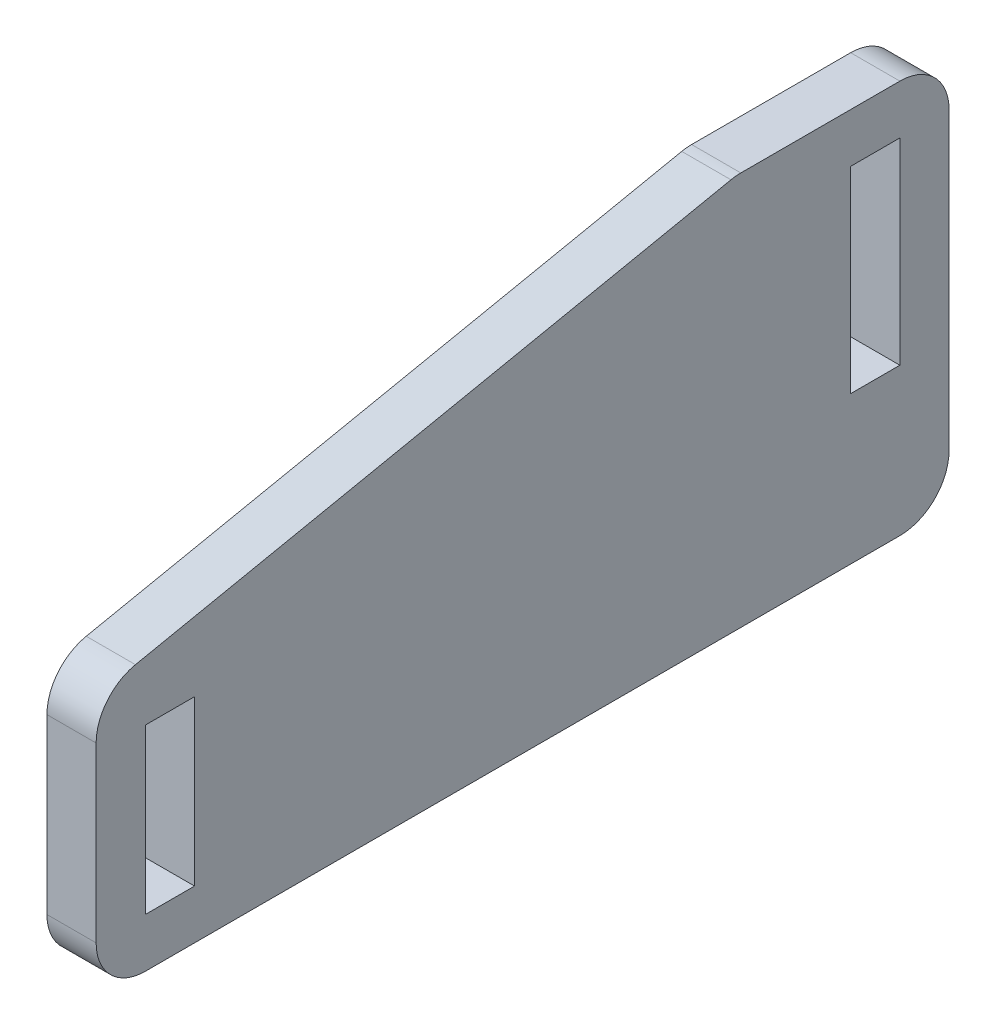
ISO-10303-21;
HEADER;
FILE_DESCRIPTION(('STEP AP214'),'2;1');
FILE_NAME('part.step','',(''),(''),'','','');
FILE_SCHEMA(('AUTOMOTIVE_DESIGN { 1 0 10303 214 1 1 1 1 }'));
ENDSEC;
DATA;
#1=APPLICATION_CONTEXT('core data for automotive mechanical design processes');
#2=APPLICATION_PROTOCOL_DEFINITION('international standard','automotive_design',2000,#1);
#3=PRODUCT_CONTEXT('',#1,'mechanical');
#4=PRODUCT('Part','Part','',(#3));
#5=PRODUCT_RELATED_PRODUCT_CATEGORY('part','',(#4));
#6=PRODUCT_DEFINITION_FORMATION('','',#4);
#7=PRODUCT_DEFINITION_CONTEXT('part definition',#1,'design');
#8=PRODUCT_DEFINITION('design','',#6,#7);
#9=PRODUCT_DEFINITION_SHAPE('','',#8);
#10=(LENGTH_UNIT() NAMED_UNIT(*) SI_UNIT(.MILLI.,.METRE.));
#11=(NAMED_UNIT(*) PLANE_ANGLE_UNIT() SI_UNIT($,.RADIAN.));
#12=(NAMED_UNIT(*) SI_UNIT($,.STERADIAN.) SOLID_ANGLE_UNIT());
#13=UNCERTAINTY_MEASURE_WITH_UNIT(LENGTH_MEASURE(1.E-05),#10,'distance_accuracy_value','');
#14=(GEOMETRIC_REPRESENTATION_CONTEXT(3) GLOBAL_UNCERTAINTY_ASSIGNED_CONTEXT((#13)) GLOBAL_UNIT_ASSIGNED_CONTEXT((#10,
#11,#12)) REPRESENTATION_CONTEXT('',''));
#15=CARTESIAN_POINT('',(0.,0.,0.));
#16=DIRECTION('',(0.,0.,1.));
#17=DIRECTION('',(1.,0.,0.));
#18=AXIS2_PLACEMENT_3D('',#15,#16,#17);
#19=CARTESIAN_POINT('',(3.,0.,0.));
#20=DIRECTION('',(-1.,0.,0.));
#21=DIRECTION('',(0.,0.,1.));
#22=AXIS2_PLACEMENT_3D('',#19,#20,#21);
#23=PLANE('',#22);
#24=DIRECTION('',(0.,-1.,0.));
#25=VECTOR('',#24,1.);
#26=CARTESIAN_POINT('',(3.,-9.,23.));
#27=LINE('',#26,#25);
#28=CARTESIAN_POINT('',(3.,0.999999999999997,23.));
#29=VERTEX_POINT('',#28);
#30=CARTESIAN_POINT('',(3.,-9.,23.));
#31=VERTEX_POINT('',#30);
#32=EDGE_CURVE('E224',#29,#31,#27,.T.);
#33=ORIENTED_EDGE('',*,*,#32,.F.);
#34=DIRECTION('',(0.,0.,1.));
#35=VECTOR('',#34,1.);
#36=CARTESIAN_POINT('',(3.,0.999999999999997,23.));
#37=LINE('',#36,#35);
#38=CARTESIAN_POINT('',(3.,0.999999999999997,20.));
#39=VERTEX_POINT('',#38);
#40=EDGE_CURVE('E235',#39,#29,#37,.T.);
#41=ORIENTED_EDGE('',*,*,#40,.F.);
#42=DIRECTION('',(0.,1.,0.));
#43=VECTOR('',#42,1.);
#44=CARTESIAN_POINT('',(3.,-9.,20.));
#45=LINE('',#44,#43);
#46=CARTESIAN_POINT('',(3.,-9.,20.));
#47=VERTEX_POINT('',#46);
#48=EDGE_CURVE('E231',#47,#39,#45,.T.);
#49=ORIENTED_EDGE('',*,*,#48,.F.);
#50=DIRECTION('',(0.,0.,-1.));
#51=VECTOR('',#50,1.);
#52=CARTESIAN_POINT('',(3.,-9.,23.));
#53=LINE('',#52,#51);
#54=EDGE_CURVE('E227',#31,#47,#53,.T.);
#55=ORIENTED_EDGE('',*,*,#54,.F.);
#56=EDGE_LOOP('',(#33,#41,#49,#55));
#57=FACE_BOUND('',#56,.T.);
#58=DIRECTION('',(0.,-1.,0.));
#59=VECTOR('',#58,1.);
#60=CARTESIAN_POINT('',(3.,-12.,26.));
#61=LINE('',#60,#59);
#62=CARTESIAN_POINT('',(3.,1.5529185788624,26.));
#63=VERTEX_POINT('',#62);
#64=CARTESIAN_POINT('',(3.,-9.00000000000001,26.));
#65=VERTEX_POINT('',#64);
#66=EDGE_CURVE('E267',#63,#65,#61,.T.);
#67=ORIENTED_EDGE('',*,*,#66,.T.);
#68=CARTESIAN_POINT('',(3.,-9.00000000000001,23.));
#69=DIRECTION('',(-1.,0.,0.));
#70=DIRECTION('',(0.,0.,1.));
#71=AXIS2_PLACEMENT_3D('',#68,#69,#70);
#72=CIRCLE('',#71,3.);
#73=CARTESIAN_POINT('',(3.,-12.,23.));
#74=VERTEX_POINT('',#73);
#75=EDGE_CURVE('E343',#65,#74,#72,.F.);
#76=ORIENTED_EDGE('',*,*,#75,.T.);
#77=DIRECTION('',(0.,0.,-1.));
#78=VECTOR('',#77,1.);
#79=CARTESIAN_POINT('',(3.,-12.,-26.));
#80=LINE('',#79,#78);
#81=CARTESIAN_POINT('',(3.,-12.,-23.));
#82=VERTEX_POINT('',#81);
#83=EDGE_CURVE('E271',#74,#82,#80,.T.);
#84=ORIENTED_EDGE('',*,*,#83,.T.);
#85=CARTESIAN_POINT('',(3.,-9.,-23.));
#86=DIRECTION('',(-1.,0.,0.));
#87=DIRECTION('',(0.,0.,1.));
#88=AXIS2_PLACEMENT_3D('',#85,#86,#87);
#89=CIRCLE('',#88,3.);
#90=CARTESIAN_POINT('',(3.,-9.,-26.));
#91=VERTEX_POINT('',#90);
#92=EDGE_CURVE('E340',#82,#91,#89,.F.);
#93=ORIENTED_EDGE('',*,*,#92,.T.);
#94=DIRECTION('',(0.,1.,0.));
#95=VECTOR('',#94,1.);
#96=CARTESIAN_POINT('',(3.,12.,-26.));
#97=LINE('',#96,#95);
#98=CARTESIAN_POINT('',(3.,9.,-26.));
#99=VERTEX_POINT('',#98);
#100=EDGE_CURVE('E276',#91,#99,#97,.T.);
#101=ORIENTED_EDGE('',*,*,#100,.T.);
#102=CARTESIAN_POINT('',(3.,9.,-23.));
#103=DIRECTION('',(-1.,0.,0.));
#104=DIRECTION('',(0.,0.,1.));
#105=AXIS2_PLACEMENT_3D('',#102,#103,#104);
#106=CIRCLE('',#105,3.);
#107=CARTESIAN_POINT('',(3.,12.,-23.));
#108=VERTEX_POINT('',#107);
#109=EDGE_CURVE('E337',#99,#108,#106,.F.);
#110=ORIENTED_EDGE('',*,*,#109,.T.);
#111=DIRECTION('',(0.,0.,1.));
#112=VECTOR('',#111,1.);
#113=CARTESIAN_POINT('',(3.,12.,-13.));
#114=LINE('',#113,#112);
#115=CARTESIAN_POINT('',(3.,12.,-13.3045219280458));
#116=VERTEX_POINT('',#115);
#117=EDGE_CURVE('E280',#108,#116,#114,.T.);
#118=ORIENTED_EDGE('',*,*,#117,.T.);
#119=CARTESIAN_POINT('',(3.,9.,-13.3045219280458));
#120=DIRECTION('',(-1.,0.,0.));
#121=DIRECTION('',(0.,0.,1.));
#122=AXIS2_PLACEMENT_3D('',#119,#120,#121);
#123=CIRCLE('',#122,3.);
#124=CARTESIAN_POINT('',(3.,11.9388081019245,-12.7016894968818));
#125=VERTEX_POINT('',#124);
#126=EDGE_CURVE('E65',#116,#125,#123,.F.);
#127=ORIENTED_EDGE('',*,*,#126,.T.);
#128=DIRECTION('',(0.,-0.200944143721331,0.97960270064149));
#129=VECTOR('',#128,1.);
#130=CARTESIAN_POINT('',(3.,3.99999999999999,26.));
#131=LINE('',#130,#129);
#132=CARTESIAN_POINT('',(3.,4.49172668078687,23.602832431164));
#133=VERTEX_POINT('',#132);
#134=EDGE_CURVE('E283',#125,#133,#131,.T.);
#135=ORIENTED_EDGE('',*,*,#134,.T.);
#136=CARTESIAN_POINT('',(3.,1.5529185788624,23.));
#137=DIRECTION('',(-1.,0.,0.));
#138=DIRECTION('',(0.,0.,1.));
#139=AXIS2_PLACEMENT_3D('',#136,#137,#138);
#140=CIRCLE('',#139,3.);
#141=EDGE_CURVE('E332',#133,#63,#140,.F.);
#142=ORIENTED_EDGE('',*,*,#141,.T.);
#143=EDGE_LOOP('',(#67,#76,#84,#93,#101,#110,#118,#127,#135,#142));
#144=FACE_BOUND('',#143,.T.);
#145=DIRECTION('',(0.,-1.,0.));
#146=VECTOR('',#145,1.);
#147=CARTESIAN_POINT('',(3.,-3.,-20.));
#148=LINE('',#147,#146);
#149=CARTESIAN_POINT('',(3.,9.,-20.));
#150=VERTEX_POINT('',#149);
#151=CARTESIAN_POINT('',(3.,-3.,-20.));
#152=VERTEX_POINT('',#151);
#153=EDGE_CURVE('E171',#150,#152,#148,.T.);
#154=ORIENTED_EDGE('',*,*,#153,.F.);
#155=DIRECTION('',(0.,0.,1.));
#156=VECTOR('',#155,1.);
#157=CARTESIAN_POINT('',(3.,9.,-20.));
#158=LINE('',#157,#156);
#159=CARTESIAN_POINT('',(3.,9.,-23.));
#160=VERTEX_POINT('',#159);
#161=EDGE_CURVE('E200',#160,#150,#158,.T.);
#162=ORIENTED_EDGE('',*,*,#161,.F.);
#163=DIRECTION('',(0.,1.,0.));
#164=VECTOR('',#163,1.);
#165=CARTESIAN_POINT('',(3.,-3.,-23.));
#166=LINE('',#165,#164);
#167=CARTESIAN_POINT('',(3.,-3.,-23.));
#168=VERTEX_POINT('',#167);
#169=EDGE_CURVE('E196',#168,#160,#166,.T.);
#170=ORIENTED_EDGE('',*,*,#169,.F.);
#171=DIRECTION('',(0.,0.,-1.));
#172=VECTOR('',#171,1.);
#173=CARTESIAN_POINT('',(3.,-3.,-20.));
#174=LINE('',#173,#172);
#175=EDGE_CURVE('E182',#152,#168,#174,.T.);
#176=ORIENTED_EDGE('',*,*,#175,.F.);
#177=EDGE_LOOP('',(#154,#162,#170,#176));
#178=FACE_BOUND('',#177,.T.);
#179=ADVANCED_FACE('F43',(#57,#144,#178),#23,.F.);
#180=CARTESIAN_POINT('',(0.,0.,0.));
#181=DIRECTION('',(-1.,0.,0.));
#182=DIRECTION('',(0.,0.,1.));
#183=AXIS2_PLACEMENT_3D('',#180,#181,#182);
#184=PLANE('',#183);
#185=DIRECTION('',(0.,0.,-1.));
#186=VECTOR('',#185,1.);
#187=CARTESIAN_POINT('',(0.,-12.,-26.));
#188=LINE('',#187,#186);
#189=CARTESIAN_POINT('',(0.,-12.,23.));
#190=VERTEX_POINT('',#189);
#191=CARTESIAN_POINT('',(0.,-12.,-23.));
#192=VERTEX_POINT('',#191);
#193=EDGE_CURVE('E290',#190,#192,#188,.T.);
#194=ORIENTED_EDGE('',*,*,#193,.F.);
#195=CARTESIAN_POINT('',(0.,-9.00000000000001,23.));
#196=DIRECTION('',(-1.,0.,0.));
#197=DIRECTION('',(0.,0.,1.));
#198=AXIS2_PLACEMENT_3D('',#195,#196,#197);
#199=CIRCLE('',#198,3.);
#200=CARTESIAN_POINT('',(0.,-9.00000000000001,26.));
#201=VERTEX_POINT('',#200);
#202=EDGE_CURVE('E322',#190,#201,#199,.T.);
#203=ORIENTED_EDGE('',*,*,#202,.T.);
#204=DIRECTION('',(0.,-1.,0.));
#205=VECTOR('',#204,1.);
#206=CARTESIAN_POINT('',(0.,-12.,26.));
#207=LINE('',#206,#205);
#208=CARTESIAN_POINT('',(0.,1.5529185788624,26.));
#209=VERTEX_POINT('',#208);
#210=EDGE_CURVE('E266',#209,#201,#207,.T.);
#211=ORIENTED_EDGE('',*,*,#210,.F.);
#212=CARTESIAN_POINT('',(0.,1.5529185788624,23.));
#213=DIRECTION('',(-1.,0.,0.));
#214=DIRECTION('',(0.,0.,1.));
#215=AXIS2_PLACEMENT_3D('',#212,#213,#214);
#216=CIRCLE('',#215,3.);
#217=CARTESIAN_POINT('',(0.,4.49172668078687,23.602832431164));
#218=VERTEX_POINT('',#217);
#219=EDGE_CURVE('E310',#209,#218,#216,.T.);
#220=ORIENTED_EDGE('',*,*,#219,.T.);
#221=DIRECTION('',(0.,-0.200944143721331,0.97960270064149));
#222=VECTOR('',#221,1.);
#223=CARTESIAN_POINT('',(0.,3.99999999999999,26.));
#224=LINE('',#223,#222);
#225=CARTESIAN_POINT('',(0.,11.9388081019245,-12.7016894968818));
#226=VERTEX_POINT('',#225);
#227=EDGE_CURVE('E272',#226,#218,#224,.T.);
#228=ORIENTED_EDGE('',*,*,#227,.F.);
#229=CARTESIAN_POINT('',(0.,9.,-13.3045219280458));
#230=DIRECTION('',(-1.,0.,0.));
#231=DIRECTION('',(0.,0.,1.));
#232=AXIS2_PLACEMENT_3D('',#229,#230,#231);
#233=CIRCLE('',#232,3.);
#234=CARTESIAN_POINT('',(0.,12.,-13.3045219280458));
#235=VERTEX_POINT('',#234);
#236=EDGE_CURVE('E313',#226,#235,#233,.T.);
#237=ORIENTED_EDGE('',*,*,#236,.T.);
#238=DIRECTION('',(0.,0.,1.));
#239=VECTOR('',#238,1.);
#240=CARTESIAN_POINT('',(0.,12.,-13.));
#241=LINE('',#240,#239);
#242=CARTESIAN_POINT('',(0.,12.,-23.));
#243=VERTEX_POINT('',#242);
#244=EDGE_CURVE('E298',#243,#235,#241,.T.);
#245=ORIENTED_EDGE('',*,*,#244,.F.);
#246=CARTESIAN_POINT('',(0.,9.,-23.));
#247=DIRECTION('',(-1.,0.,0.));
#248=DIRECTION('',(0.,0.,1.));
#249=AXIS2_PLACEMENT_3D('',#246,#247,#248);
#250=CIRCLE('',#249,3.);
#251=CARTESIAN_POINT('',(0.,9.,-26.));
#252=VERTEX_POINT('',#251);
#253=EDGE_CURVE('E316',#243,#252,#250,.T.);
#254=ORIENTED_EDGE('',*,*,#253,.T.);
#255=DIRECTION('',(0.,1.,0.));
#256=VECTOR('',#255,1.);
#257=CARTESIAN_POINT('',(0.,12.,-26.));
#258=LINE('',#257,#256);
#259=CARTESIAN_POINT('',(0.,-9.,-26.));
#260=VERTEX_POINT('',#259);
#261=EDGE_CURVE('E294',#260,#252,#258,.T.);
#262=ORIENTED_EDGE('',*,*,#261,.F.);
#263=CARTESIAN_POINT('',(0.,-9.,-23.));
#264=DIRECTION('',(-1.,0.,0.));
#265=DIRECTION('',(0.,0.,1.));
#266=AXIS2_PLACEMENT_3D('',#263,#264,#265);
#267=CIRCLE('',#266,3.);
#268=EDGE_CURVE('E319',#260,#192,#267,.T.);
#269=ORIENTED_EDGE('',*,*,#268,.T.);
#270=EDGE_LOOP('',(#194,#203,#211,#220,#228,#237,#245,#254,#262,#269));
#271=FACE_BOUND('',#270,.T.);
#272=DIRECTION('',(0.,0.,1.));
#273=VECTOR('',#272,1.);
#274=CARTESIAN_POINT('',(0.,0.999999999999997,23.));
#275=LINE('',#274,#273);
#276=CARTESIAN_POINT('',(0.,0.999999999999997,20.));
#277=VERTEX_POINT('',#276);
#278=CARTESIAN_POINT('',(0.,0.999999999999997,23.));
#279=VERTEX_POINT('',#278);
#280=EDGE_CURVE('E228',#277,#279,#275,.T.);
#281=ORIENTED_EDGE('',*,*,#280,.T.);
#282=DIRECTION('',(0.,-1.,0.));
#283=VECTOR('',#282,1.);
#284=CARTESIAN_POINT('',(0.,-9.,23.));
#285=LINE('',#284,#283);
#286=CARTESIAN_POINT('',(0.,-9.,23.));
#287=VERTEX_POINT('',#286);
#288=EDGE_CURVE('E191',#279,#287,#285,.T.);
#289=ORIENTED_EDGE('',*,*,#288,.T.);
#290=DIRECTION('',(0.,0.,-1.));
#291=VECTOR('',#290,1.);
#292=CARTESIAN_POINT('',(0.,-9.,23.));
#293=LINE('',#292,#291);
#294=CARTESIAN_POINT('',(0.,-9.,20.));
#295=VERTEX_POINT('',#294);
#296=EDGE_CURVE('E242',#287,#295,#293,.T.);
#297=ORIENTED_EDGE('',*,*,#296,.T.);
#298=DIRECTION('',(0.,1.,0.));
#299=VECTOR('',#298,1.);
#300=CARTESIAN_POINT('',(0.,-9.,20.));
#301=LINE('',#300,#299);
#302=EDGE_CURVE('E246',#295,#277,#301,.T.);
#303=ORIENTED_EDGE('',*,*,#302,.T.);
#304=EDGE_LOOP('',(#281,#289,#297,#303));
#305=FACE_BOUND('',#304,.T.);
#306=DIRECTION('',(0.,0.,1.));
#307=VECTOR('',#306,1.);
#308=CARTESIAN_POINT('',(0.,9.,-20.));
#309=LINE('',#308,#307);
#310=CARTESIAN_POINT('',(0.,9.,-23.));
#311=VERTEX_POINT('',#310);
#312=CARTESIAN_POINT('',(0.,9.,-20.));
#313=VERTEX_POINT('',#312);
#314=EDGE_CURVE('E183',#311,#313,#309,.T.);
#315=ORIENTED_EDGE('',*,*,#314,.T.);
#316=DIRECTION('',(0.,-1.,0.));
#317=VECTOR('',#316,1.);
#318=CARTESIAN_POINT('',(0.,-3.,-20.));
#319=LINE('',#318,#317);
#320=CARTESIAN_POINT('',(0.,-3.,-20.));
#321=VERTEX_POINT('',#320);
#322=EDGE_CURVE('E205',#313,#321,#319,.T.);
#323=ORIENTED_EDGE('',*,*,#322,.T.);
#324=DIRECTION('',(0.,0.,-1.));
#325=VECTOR('',#324,1.);
#326=CARTESIAN_POINT('',(0.,-3.,-20.));
#327=LINE('',#326,#325);
#328=CARTESIAN_POINT('',(0.,-3.,-23.));
#329=VERTEX_POINT('',#328);
#330=EDGE_CURVE('E189',#321,#329,#327,.T.);
#331=ORIENTED_EDGE('',*,*,#330,.T.);
#332=DIRECTION('',(0.,1.,0.));
#333=VECTOR('',#332,1.);
#334=CARTESIAN_POINT('',(0.,-3.,-23.));
#335=LINE('',#334,#333);
#336=EDGE_CURVE('E210',#329,#311,#335,.T.);
#337=ORIENTED_EDGE('',*,*,#336,.T.);
#338=EDGE_LOOP('',(#315,#323,#331,#337));
#339=FACE_BOUND('',#338,.T.);
#340=ADVANCED_FACE('F370',(#271,#305,#339),#184,.T.);
#341=CARTESIAN_POINT('',(3.,-12.,26.));
#342=DIRECTION('',(0.,0.,-1.));
#343=DIRECTION('',(-1.,0.,0.));
#344=AXIS2_PLACEMENT_3D('',#341,#342,#343);
#345=PLANE('',#344);
#346=ORIENTED_EDGE('',*,*,#210,.T.);
#347=DIRECTION('',(-1.,0.,0.));
#348=VECTOR('',#347,1.);
#349=CARTESIAN_POINT('',(3.,-9.00000000000001,26.));
#350=LINE('',#349,#348);
#351=EDGE_CURVE('E329',#201,#65,#350,.F.);
#352=ORIENTED_EDGE('',*,*,#351,.T.);
#353=ORIENTED_EDGE('',*,*,#66,.F.);
#354=DIRECTION('',(-1.,0.,0.));
#355=VECTOR('',#354,1.);
#356=CARTESIAN_POINT('',(3.,1.5529185788624,26.));
#357=LINE('',#356,#355);
#358=EDGE_CURVE('E325',#63,#209,#357,.T.);
#359=ORIENTED_EDGE('',*,*,#358,.T.);
#360=EDGE_LOOP('',(#346,#352,#353,#359));
#361=FACE_BOUND('',#360,.T.);
#362=ADVANCED_FACE('F384',(#361),#345,.F.);
#363=CARTESIAN_POINT('',(3.,-12.,-26.));
#364=DIRECTION('',(0.,1.,0.));
#365=DIRECTION('',(0.,0.,1.));
#366=AXIS2_PLACEMENT_3D('',#363,#364,#365);
#367=PLANE('',#366);
#368=ORIENTED_EDGE('',*,*,#83,.F.);
#369=DIRECTION('',(-1.,0.,0.));
#370=VECTOR('',#369,1.);
#371=CARTESIAN_POINT('',(3.,-12.,23.));
#372=LINE('',#371,#370);
#373=EDGE_CURVE('E306',#74,#190,#372,.T.);
#374=ORIENTED_EDGE('',*,*,#373,.T.);
#375=ORIENTED_EDGE('',*,*,#193,.T.);
#376=DIRECTION('',(-1.,0.,0.));
#377=VECTOR('',#376,1.);
#378=CARTESIAN_POINT('',(3.,-12.,-23.));
#379=LINE('',#378,#377);
#380=EDGE_CURVE('E286',#192,#82,#379,.F.);
#381=ORIENTED_EDGE('',*,*,#380,.T.);
#382=EDGE_LOOP('',(#368,#374,#375,#381));
#383=FACE_BOUND('',#382,.T.);
#384=ADVANCED_FACE('F392',(#383),#367,.F.);
#385=CARTESIAN_POINT('',(3.,12.,-26.));
#386=DIRECTION('',(0.,0.,1.));
#387=DIRECTION('',(1.,0.,0.));
#388=AXIS2_PLACEMENT_3D('',#385,#386,#387);
#389=PLANE('',#388);
#390=ORIENTED_EDGE('',*,*,#100,.F.);
#391=DIRECTION('',(-1.,0.,0.));
#392=VECTOR('',#391,1.);
#393=CARTESIAN_POINT('',(3.,-9.,-26.));
#394=LINE('',#393,#392);
#395=EDGE_CURVE('E349',#91,#260,#394,.T.);
#396=ORIENTED_EDGE('',*,*,#395,.T.);
#397=ORIENTED_EDGE('',*,*,#261,.T.);
#398=DIRECTION('',(-1.,0.,0.));
#399=VECTOR('',#398,1.);
#400=CARTESIAN_POINT('',(3.,9.,-26.));
#401=LINE('',#400,#399);
#402=EDGE_CURVE('E346',#252,#99,#401,.F.);
#403=ORIENTED_EDGE('',*,*,#402,.T.);
#404=EDGE_LOOP('',(#390,#396,#397,#403));
#405=FACE_BOUND('',#404,.T.);
#406=ADVANCED_FACE('F400',(#405),#389,.F.);
#407=CARTESIAN_POINT('',(3.,12.,-13.));
#408=DIRECTION('',(0.,-1.,0.));
#409=DIRECTION('',(0.,0.,-1.));
#410=AXIS2_PLACEMENT_3D('',#407,#408,#409);
#411=PLANE('',#410);
#412=ORIENTED_EDGE('',*,*,#117,.F.);
#413=DIRECTION('',(-1.,0.,0.));
#414=VECTOR('',#413,1.);
#415=CARTESIAN_POINT('',(3.,12.,-23.));
#416=LINE('',#415,#414);
#417=EDGE_CURVE('E356',#108,#243,#416,.T.);
#418=ORIENTED_EDGE('',*,*,#417,.T.);
#419=ORIENTED_EDGE('',*,*,#244,.T.);
#420=DIRECTION('',(-1.,0.,0.));
#421=VECTOR('',#420,1.);
#422=CARTESIAN_POINT('',(3.,12.,-13.3045219280458));
#423=LINE('',#422,#421);
#424=EDGE_CURVE('E353',#235,#116,#423,.F.);
#425=ORIENTED_EDGE('',*,*,#424,.T.);
#426=EDGE_LOOP('',(#412,#418,#419,#425));
#427=FACE_BOUND('',#426,.T.);
#428=ADVANCED_FACE('F364',(#427),#411,.F.);
#429=CARTESIAN_POINT('',(3.,3.99999999999999,26.));
#430=DIRECTION('',(0.,-0.97960270064149,-0.200944143721331));
#431=DIRECTION('',(0.,0.200944143721331,-0.97960270064149));
#432=AXIS2_PLACEMENT_3D('',#429,#430,#431);
#433=PLANE('',#432);
#434=ORIENTED_EDGE('',*,*,#134,.F.);
#435=DIRECTION('',(-1.,0.,0.));
#436=VECTOR('',#435,1.);
#437=CARTESIAN_POINT('',(3.,11.9388081019245,-12.7016894968818));
#438=LINE('',#437,#436);
#439=EDGE_CURVE('E11',#125,#226,#438,.T.);
#440=ORIENTED_EDGE('',*,*,#439,.T.);
#441=ORIENTED_EDGE('',*,*,#227,.T.);
#442=DIRECTION('',(-1.,0.,0.));
#443=VECTOR('',#442,1.);
#444=CARTESIAN_POINT('',(3.,4.49172668078687,23.602832431164));
#445=LINE('',#444,#443);
#446=EDGE_CURVE('E52',#218,#133,#445,.F.);
#447=ORIENTED_EDGE('',*,*,#446,.T.);
#448=EDGE_LOOP('',(#434,#440,#441,#447));
#449=FACE_BOUND('',#448,.T.);
#450=ADVANCED_FACE('F377',(#449),#433,.F.);
#451=CARTESIAN_POINT('',(3.,-9.,23.));
#452=DIRECTION('',(0.,0.,-1.));
#453=DIRECTION('',(-1.,0.,0.));
#454=AXIS2_PLACEMENT_3D('',#451,#452,#453);
#455=PLANE('',#454);
#456=ORIENTED_EDGE('',*,*,#288,.F.);
#457=DIRECTION('',(-1.,0.,0.));
#458=VECTOR('',#457,1.);
#459=CARTESIAN_POINT('',(3.,0.999999999999997,23.));
#460=LINE('',#459,#458);
#461=EDGE_CURVE('E238',#29,#279,#460,.T.);
#462=ORIENTED_EDGE('',*,*,#461,.F.);
#463=ORIENTED_EDGE('',*,*,#32,.T.);
#464=DIRECTION('',(-1.,0.,0.));
#465=VECTOR('',#464,1.);
#466=CARTESIAN_POINT('',(3.,-9.,23.));
#467=LINE('',#466,#465);
#468=EDGE_CURVE('E262',#31,#287,#467,.T.);
#469=ORIENTED_EDGE('',*,*,#468,.T.);
#470=EDGE_LOOP('',(#456,#462,#463,#469));
#471=FACE_BOUND('',#470,.T.);
#472=ADVANCED_FACE('F419',(#471),#455,.T.);
#473=CARTESIAN_POINT('',(3.,-9.,23.));
#474=DIRECTION('',(0.,1.,0.));
#475=DIRECTION('',(0.,0.,1.));
#476=AXIS2_PLACEMENT_3D('',#473,#474,#475);
#477=PLANE('',#476);
#478=ORIENTED_EDGE('',*,*,#296,.F.);
#479=ORIENTED_EDGE('',*,*,#468,.F.);
#480=ORIENTED_EDGE('',*,*,#54,.T.);
#481=DIRECTION('',(-1.,0.,0.));
#482=VECTOR('',#481,1.);
#483=CARTESIAN_POINT('',(3.,-9.,20.));
#484=LINE('',#483,#482);
#485=EDGE_CURVE('E259',#47,#295,#484,.T.);
#486=ORIENTED_EDGE('',*,*,#485,.T.);
#487=EDGE_LOOP('',(#478,#479,#480,#486));
#488=FACE_BOUND('',#487,.T.);
#489=ADVANCED_FACE('F457',(#488),#477,.T.);
#490=CARTESIAN_POINT('',(3.,-9.,20.));
#491=DIRECTION('',(0.,0.,1.));
#492=DIRECTION('',(1.,0.,0.));
#493=AXIS2_PLACEMENT_3D('',#490,#491,#492);
#494=PLANE('',#493);
#495=ORIENTED_EDGE('',*,*,#302,.F.);
#496=ORIENTED_EDGE('',*,*,#485,.F.);
#497=ORIENTED_EDGE('',*,*,#48,.T.);
#498=DIRECTION('',(-1.,0.,0.));
#499=VECTOR('',#498,1.);
#500=CARTESIAN_POINT('',(3.,0.999999999999997,20.));
#501=LINE('',#500,#499);
#502=EDGE_CURVE('E256',#39,#277,#501,.T.);
#503=ORIENTED_EDGE('',*,*,#502,.T.);
#504=EDGE_LOOP('',(#495,#496,#497,#503));
#505=FACE_BOUND('',#504,.T.);
#506=ADVANCED_FACE('F454',(#505),#494,.T.);
#507=CARTESIAN_POINT('',(3.,0.999999999999997,23.));
#508=DIRECTION('',(0.,-1.,0.));
#509=DIRECTION('',(0.,0.,-1.));
#510=AXIS2_PLACEMENT_3D('',#507,#508,#509);
#511=PLANE('',#510);
#512=ORIENTED_EDGE('',*,*,#280,.F.);
#513=ORIENTED_EDGE('',*,*,#502,.F.);
#514=ORIENTED_EDGE('',*,*,#40,.T.);
#515=ORIENTED_EDGE('',*,*,#461,.T.);
#516=EDGE_LOOP('',(#512,#513,#514,#515));
#517=FACE_BOUND('',#516,.T.);
#518=ADVANCED_FACE('F451',(#517),#511,.T.);
#519=CARTESIAN_POINT('',(3.,-3.,-20.));
#520=DIRECTION('',(0.,0.,-1.));
#521=DIRECTION('',(-1.,0.,0.));
#522=AXIS2_PLACEMENT_3D('',#519,#520,#521);
#523=PLANE('',#522);
#524=ORIENTED_EDGE('',*,*,#322,.F.);
#525=DIRECTION('',(-1.,0.,0.));
#526=VECTOR('',#525,1.);
#527=CARTESIAN_POINT('',(3.,9.,-20.));
#528=LINE('',#527,#526);
#529=EDGE_CURVE('E177',#150,#313,#528,.T.);
#530=ORIENTED_EDGE('',*,*,#529,.F.);
#531=ORIENTED_EDGE('',*,*,#153,.T.);
#532=DIRECTION('',(-1.,0.,0.));
#533=VECTOR('',#532,1.);
#534=CARTESIAN_POINT('',(3.,-3.,-20.));
#535=LINE('',#534,#533);
#536=EDGE_CURVE('E174',#152,#321,#535,.T.);
#537=ORIENTED_EDGE('',*,*,#536,.T.);
#538=EDGE_LOOP('',(#524,#530,#531,#537));
#539=FACE_BOUND('',#538,.T.);
#540=ADVANCED_FACE('F173',(#539),#523,.T.);
#541=CARTESIAN_POINT('',(3.,-3.,-20.));
#542=DIRECTION('',(0.,1.,0.));
#543=DIRECTION('',(0.,0.,1.));
#544=AXIS2_PLACEMENT_3D('',#541,#542,#543);
#545=PLANE('',#544);
#546=ORIENTED_EDGE('',*,*,#330,.F.);
#547=ORIENTED_EDGE('',*,*,#536,.F.);
#548=ORIENTED_EDGE('',*,*,#175,.T.);
#549=DIRECTION('',(-1.,0.,0.));
#550=VECTOR('',#549,1.);
#551=CARTESIAN_POINT('',(3.,-3.,-23.));
#552=LINE('',#551,#550);
#553=EDGE_CURVE('E192',#168,#329,#552,.T.);
#554=ORIENTED_EDGE('',*,*,#553,.T.);
#555=EDGE_LOOP('',(#546,#547,#548,#554));
#556=FACE_BOUND('',#555,.T.);
#557=ADVANCED_FACE('F186',(#556),#545,.T.);
#558=CARTESIAN_POINT('',(3.,-3.,-23.));
#559=DIRECTION('',(0.,0.,1.));
#560=DIRECTION('',(1.,0.,0.));
#561=AXIS2_PLACEMENT_3D('',#558,#559,#560);
#562=PLANE('',#561);
#563=ORIENTED_EDGE('',*,*,#336,.F.);
#564=ORIENTED_EDGE('',*,*,#553,.F.);
#565=ORIENTED_EDGE('',*,*,#169,.T.);
#566=DIRECTION('',(-1.,0.,0.));
#567=VECTOR('',#566,1.);
#568=CARTESIAN_POINT('',(3.,9.,-23.));
#569=LINE('',#568,#567);
#570=EDGE_CURVE('E219',#160,#311,#569,.T.);
#571=ORIENTED_EDGE('',*,*,#570,.T.);
#572=EDGE_LOOP('',(#563,#564,#565,#571));
#573=FACE_BOUND('',#572,.T.);
#574=ADVANCED_FACE('F437',(#573),#562,.T.);
#575=CARTESIAN_POINT('',(3.,9.,-20.));
#576=DIRECTION('',(0.,-1.,0.));
#577=DIRECTION('',(0.,0.,-1.));
#578=AXIS2_PLACEMENT_3D('',#575,#576,#577);
#579=PLANE('',#578);
#580=ORIENTED_EDGE('',*,*,#314,.F.);
#581=ORIENTED_EDGE('',*,*,#570,.F.);
#582=ORIENTED_EDGE('',*,*,#161,.T.);
#583=ORIENTED_EDGE('',*,*,#529,.T.);
#584=EDGE_LOOP('',(#580,#581,#582,#583));
#585=FACE_BOUND('',#584,.T.);
#586=ADVANCED_FACE('F433',(#585),#579,.T.);
#587=CARTESIAN_POINT('',(3.,-9.00000000000001,23.));
#588=DIRECTION('',(-1.,0.,0.));
#589=DIRECTION('',(0.,0.,1.));
#590=AXIS2_PLACEMENT_3D('',#587,#588,#589);
#591=CYLINDRICAL_SURFACE('',#590,3.);
#592=ORIENTED_EDGE('',*,*,#75,.F.);
#593=ORIENTED_EDGE('',*,*,#351,.F.);
#594=ORIENTED_EDGE('',*,*,#202,.F.);
#595=ORIENTED_EDGE('',*,*,#373,.F.);
#596=EDGE_LOOP('',(#592,#593,#594,#595));
#597=FACE_BOUND('',#596,.T.);
#598=ADVANCED_FACE('F389',(#597),#591,.T.);
#599=CARTESIAN_POINT('',(3.,-9.,-23.));
#600=DIRECTION('',(-1.,0.,0.));
#601=DIRECTION('',(0.,0.,1.));
#602=AXIS2_PLACEMENT_3D('',#599,#600,#601);
#603=CYLINDRICAL_SURFACE('',#602,3.);
#604=ORIENTED_EDGE('',*,*,#92,.F.);
#605=ORIENTED_EDGE('',*,*,#380,.F.);
#606=ORIENTED_EDGE('',*,*,#268,.F.);
#607=ORIENTED_EDGE('',*,*,#395,.F.);
#608=EDGE_LOOP('',(#604,#605,#606,#607));
#609=FACE_BOUND('',#608,.T.);
#610=ADVANCED_FACE('F398',(#609),#603,.T.);
#611=CARTESIAN_POINT('',(3.,9.,-23.));
#612=DIRECTION('',(-1.,0.,0.));
#613=DIRECTION('',(0.,0.,1.));
#614=AXIS2_PLACEMENT_3D('',#611,#612,#613);
#615=CYLINDRICAL_SURFACE('',#614,3.);
#616=ORIENTED_EDGE('',*,*,#109,.F.);
#617=ORIENTED_EDGE('',*,*,#402,.F.);
#618=ORIENTED_EDGE('',*,*,#253,.F.);
#619=ORIENTED_EDGE('',*,*,#417,.F.);
#620=EDGE_LOOP('',(#616,#617,#618,#619));
#621=FACE_BOUND('',#620,.T.);
#622=ADVANCED_FACE('F402',(#621),#615,.T.);
#623=CARTESIAN_POINT('',(3.,9.,-13.3045219280458));
#624=DIRECTION('',(-1.,0.,0.));
#625=DIRECTION('',(0.,0.,1.));
#626=AXIS2_PLACEMENT_3D('',#623,#624,#625);
#627=CYLINDRICAL_SURFACE('',#626,3.);
#628=ORIENTED_EDGE('',*,*,#126,.F.);
#629=ORIENTED_EDGE('',*,*,#424,.F.);
#630=ORIENTED_EDGE('',*,*,#236,.F.);
#631=ORIENTED_EDGE('',*,*,#439,.F.);
#632=EDGE_LOOP('',(#628,#629,#630,#631));
#633=FACE_BOUND('',#632,.T.);
#634=ADVANCED_FACE('F376',(#633),#627,.T.);
#635=CARTESIAN_POINT('',(3.,1.5529185788624,23.));
#636=DIRECTION('',(-1.,0.,0.));
#637=DIRECTION('',(0.,0.,1.));
#638=AXIS2_PLACEMENT_3D('',#635,#636,#637);
#639=CYLINDRICAL_SURFACE('',#638,3.);
#640=ORIENTED_EDGE('',*,*,#141,.F.);
#641=ORIENTED_EDGE('',*,*,#446,.F.);
#642=ORIENTED_EDGE('',*,*,#219,.F.);
#643=ORIENTED_EDGE('',*,*,#358,.F.);
#644=EDGE_LOOP('',(#640,#641,#642,#643));
#645=FACE_BOUND('',#644,.T.);
#646=ADVANCED_FACE('F45',(#645),#639,.T.);
#647=CLOSED_SHELL('',(#179,#340,#362,#384,#406,#428,#450,#472,#489,#506,#518,#540,#557,#574,
#586,#598,#610,#622,#634,#646));
#648=MANIFOLD_SOLID_BREP('B2',#647);
#649=ADVANCED_BREP_SHAPE_REPRESENTATION('',(#18,#648),#14);
#650=SHAPE_DEFINITION_REPRESENTATION(#9,#649);
ENDSEC;
END-ISO-10303-21;
